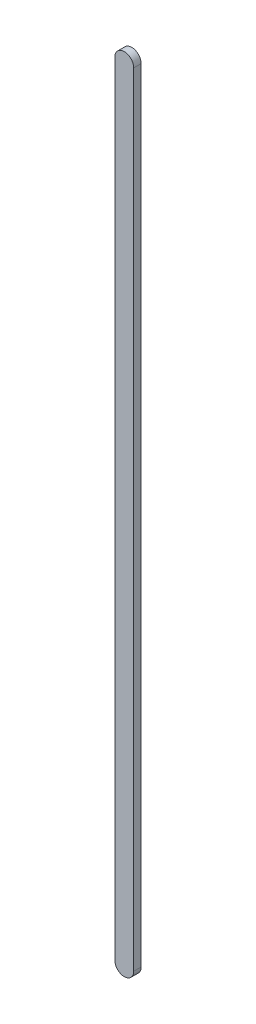
ISO-10303-21;
HEADER;
FILE_DESCRIPTION(('STEP AP214'),'2;1');
FILE_NAME('part.step','',(''),(''),'','','');
FILE_SCHEMA(('AUTOMOTIVE_DESIGN { 1 0 10303 214 1 1 1 1 }'));
ENDSEC;
DATA;
#1=APPLICATION_CONTEXT('core data for automotive mechanical design processes');
#2=APPLICATION_PROTOCOL_DEFINITION('international standard','automotive_design',2000,#1);
#3=PRODUCT_CONTEXT('',#1,'mechanical');
#4=PRODUCT('Part','Part','',(#3));
#5=PRODUCT_RELATED_PRODUCT_CATEGORY('part','',(#4));
#6=PRODUCT_DEFINITION_FORMATION('','',#4);
#7=PRODUCT_DEFINITION_CONTEXT('part definition',#1,'design');
#8=PRODUCT_DEFINITION('design','',#6,#7);
#9=PRODUCT_DEFINITION_SHAPE('','',#8);
#10=(LENGTH_UNIT() NAMED_UNIT(*) SI_UNIT(.MILLI.,.METRE.));
#11=(NAMED_UNIT(*) PLANE_ANGLE_UNIT() SI_UNIT($,.RADIAN.));
#12=(NAMED_UNIT(*) SI_UNIT($,.STERADIAN.) SOLID_ANGLE_UNIT());
#13=UNCERTAINTY_MEASURE_WITH_UNIT(LENGTH_MEASURE(1.E-05),#10,'distance_accuracy_value','');
#14=(GEOMETRIC_REPRESENTATION_CONTEXT(3) GLOBAL_UNCERTAINTY_ASSIGNED_CONTEXT((#13)) GLOBAL_UNIT_ASSIGNED_CONTEXT((#10,
#11,#12)) REPRESENTATION_CONTEXT('',''));
#15=CARTESIAN_POINT('',(0.,0.,0.));
#16=DIRECTION('',(0.,0.,1.));
#17=DIRECTION('',(1.,0.,0.));
#18=AXIS2_PLACEMENT_3D('',#15,#16,#17);
#19=CARTESIAN_POINT('',(111.9632,96.0852028,0.));
#20=DIRECTION('',(-1.,0.,0.));
#21=DIRECTION('',(0.,1.,0.));
#22=AXIS2_PLACEMENT_3D('',#19,#20,#21);
#23=PLANE('',#22);
#24=DIRECTION('',(0.,1.,0.));
#25=VECTOR('',#24,1.);
#26=CARTESIAN_POINT('',(111.9632,96.0852028,0.1999996));
#27=LINE('',#26,#25);
#28=CARTESIAN_POINT('',(111.9632,96.0852028,0.1999996));
#29=VERTEX_POINT('',#28);
#30=CARTESIAN_POINT('',(111.9632,117.1448,0.1999996));
#31=VERTEX_POINT('',#30);
#32=EDGE_CURVE('E11',#29,#31,#27,.T.);
#33=ORIENTED_EDGE('',*,*,#32,.F.);
#34=DIRECTION('',(0.,0.,1.));
#35=VECTOR('',#34,1.);
#36=CARTESIAN_POINT('',(111.9632,96.0852028,0.));
#37=LINE('',#36,#35);
#38=CARTESIAN_POINT('',(111.9632,96.0852028,0.));
#39=VERTEX_POINT('',#38);
#40=EDGE_CURVE('E24',#39,#29,#37,.T.);
#41=ORIENTED_EDGE('',*,*,#40,.F.);
#42=DIRECTION('',(0.,1.,0.));
#43=VECTOR('',#42,1.);
#44=CARTESIAN_POINT('',(111.9632,96.0852028,0.));
#45=LINE('',#44,#43);
#46=CARTESIAN_POINT('',(111.9632,117.1448,0.));
#47=VERTEX_POINT('',#46);
#48=EDGE_CURVE('E75',#39,#47,#45,.T.);
#49=ORIENTED_EDGE('',*,*,#48,.T.);
#50=DIRECTION('',(0.,0.,1.));
#51=VECTOR('',#50,1.);
#52=CARTESIAN_POINT('',(111.9632,117.1448,0.));
#53=LINE('',#52,#51);
#54=EDGE_CURVE('E37',#47,#31,#53,.T.);
#55=ORIENTED_EDGE('',*,*,#54,.T.);
#56=EDGE_LOOP('',(#33,#41,#49,#55));
#57=FACE_BOUND('',#56,.T.);
#58=ADVANCED_FACE('F17',(#57),#23,.F.);
#59=CARTESIAN_POINT('',(111.7092,117.1448,0.));
#60=DIRECTION('',(0.,0.,-1.));
#61=DIRECTION('',(1.,0.,0.));
#62=AXIS2_PLACEMENT_3D('',#59,#60,#61);
#63=CYLINDRICAL_SURFACE('',#62,0.253999999999995);
#64=CARTESIAN_POINT('',(111.7092,117.1448,0.1999996));
#65=DIRECTION('',(0.,0.,1.));
#66=DIRECTION('',(1.,0.,0.));
#67=AXIS2_PLACEMENT_3D('',#64,#65,#66);
#68=CIRCLE('',#67,0.253999999999995);
#69=CARTESIAN_POINT('',(111.4552,117.1448,0.1999996));
#70=VERTEX_POINT('',#69);
#71=EDGE_CURVE('E83',#31,#70,#68,.T.);
#72=ORIENTED_EDGE('',*,*,#71,.F.);
#73=ORIENTED_EDGE('',*,*,#54,.F.);
#74=CARTESIAN_POINT('',(111.7092,117.1448,0.));
#75=DIRECTION('',(0.,0.,1.));
#76=DIRECTION('',(1.,0.,0.));
#77=AXIS2_PLACEMENT_3D('',#74,#75,#76);
#78=CIRCLE('',#77,0.253999999999995);
#79=CARTESIAN_POINT('',(111.4552,117.1448,0.));
#80=VERTEX_POINT('',#79);
#81=EDGE_CURVE('E81',#47,#80,#78,.T.);
#82=ORIENTED_EDGE('',*,*,#81,.T.);
#83=DIRECTION('',(0.,0.,1.));
#84=VECTOR('',#83,1.);
#85=CARTESIAN_POINT('',(111.4552,117.1448,0.));
#86=LINE('',#85,#84);
#87=EDGE_CURVE('E67',#80,#70,#86,.T.);
#88=ORIENTED_EDGE('',*,*,#87,.T.);
#89=EDGE_LOOP('',(#72,#73,#82,#88));
#90=FACE_BOUND('',#89,.T.);
#91=ADVANCED_FACE('F89',(#90),#63,.T.);
#92=CARTESIAN_POINT('',(111.4552,117.1448,0.));
#93=DIRECTION('',(1.,0.,0.));
#94=DIRECTION('',(0.,-1.,0.));
#95=AXIS2_PLACEMENT_3D('',#92,#93,#94);
#96=PLANE('',#95);
#97=DIRECTION('',(0.,-1.,0.));
#98=VECTOR('',#97,1.);
#99=CARTESIAN_POINT('',(111.4552,117.1448,0.1999996));
#100=LINE('',#99,#98);
#101=CARTESIAN_POINT('',(111.4552,96.0852028,0.1999996));
#102=VERTEX_POINT('',#101);
#103=EDGE_CURVE('E71',#70,#102,#100,.T.);
#104=ORIENTED_EDGE('',*,*,#103,.F.);
#105=ORIENTED_EDGE('',*,*,#87,.F.);
#106=DIRECTION('',(0.,-1.,0.));
#107=VECTOR('',#106,1.);
#108=CARTESIAN_POINT('',(111.4552,117.1448,0.));
#109=LINE('',#108,#107);
#110=CARTESIAN_POINT('',(111.4552,96.0852028,0.));
#111=VERTEX_POINT('',#110);
#112=EDGE_CURVE('E63',#80,#111,#109,.T.);
#113=ORIENTED_EDGE('',*,*,#112,.T.);
#114=DIRECTION('',(0.,0.,1.));
#115=VECTOR('',#114,1.);
#116=CARTESIAN_POINT('',(111.4552,96.0852028,0.));
#117=LINE('',#116,#115);
#118=EDGE_CURVE('E53',#111,#102,#117,.T.);
#119=ORIENTED_EDGE('',*,*,#118,.T.);
#120=EDGE_LOOP('',(#104,#105,#113,#119));
#121=FACE_BOUND('',#120,.T.);
#122=ADVANCED_FACE('F66',(#121),#96,.F.);
#123=CARTESIAN_POINT('',(111.7092,96.0852028,0.));
#124=DIRECTION('',(0.,0.,-1.));
#125=DIRECTION('',(-1.,0.,0.));
#126=AXIS2_PLACEMENT_3D('',#123,#124,#125);
#127=CYLINDRICAL_SURFACE('',#126,0.253999999999995);
#128=CARTESIAN_POINT('',(111.7092,96.0852028,0.1999996));
#129=DIRECTION('',(0.,0.,1.));
#130=DIRECTION('',(-1.,0.,0.));
#131=AXIS2_PLACEMENT_3D('',#128,#129,#130);
#132=CIRCLE('',#131,0.253999999999995);
#133=EDGE_CURVE('E59',#102,#29,#132,.T.);
#134=ORIENTED_EDGE('',*,*,#133,.F.);
#135=ORIENTED_EDGE('',*,*,#118,.F.);
#136=CARTESIAN_POINT('',(111.7092,96.0852028,0.));
#137=DIRECTION('',(0.,0.,1.));
#138=DIRECTION('',(-1.,0.,0.));
#139=AXIS2_PLACEMENT_3D('',#136,#137,#138);
#140=CIRCLE('',#139,0.253999999999995);
#141=EDGE_CURVE('E57',#111,#39,#140,.T.);
#142=ORIENTED_EDGE('',*,*,#141,.T.);
#143=ORIENTED_EDGE('',*,*,#40,.T.);
#144=EDGE_LOOP('',(#134,#135,#142,#143));
#145=FACE_BOUND('',#144,.T.);
#146=ADVANCED_FACE('F55',(#145),#127,.T.);
#147=CARTESIAN_POINT('',(111.9632,96.0852028,0.));
#148=DIRECTION('',(0.,0.,-1.));
#149=DIRECTION('',(-1.,0.,0.));
#150=AXIS2_PLACEMENT_3D('',#147,#148,#149);
#151=PLANE('',#150);
#152=ORIENTED_EDGE('',*,*,#141,.F.);
#153=ORIENTED_EDGE('',*,*,#112,.F.);
#154=ORIENTED_EDGE('',*,*,#81,.F.);
#155=ORIENTED_EDGE('',*,*,#48,.F.);
#156=EDGE_LOOP('',(#152,#153,#154,#155));
#157=FACE_BOUND('',#156,.T.);
#158=ADVANCED_FACE('F74',(#157),#151,.T.);
#159=CARTESIAN_POINT('',(111.9632,96.0852028,0.1999996));
#160=DIRECTION('',(0.,0.,-1.));
#161=DIRECTION('',(-1.,0.,0.));
#162=AXIS2_PLACEMENT_3D('',#159,#160,#161);
#163=PLANE('',#162);
#164=ORIENTED_EDGE('',*,*,#32,.T.);
#165=ORIENTED_EDGE('',*,*,#71,.T.);
#166=ORIENTED_EDGE('',*,*,#103,.T.);
#167=ORIENTED_EDGE('',*,*,#133,.T.);
#168=EDGE_LOOP('',(#164,#165,#166,#167));
#169=FACE_BOUND('',#168,.T.);
#170=ADVANCED_FACE('F91',(#169),#163,.F.);
#171=CLOSED_SHELL('',(#58,#91,#122,#146,#158,#170));
#172=MANIFOLD_SOLID_BREP('B1',#171);
#173=ADVANCED_BREP_SHAPE_REPRESENTATION('',(#18,#172),#14);
#174=SHAPE_DEFINITION_REPRESENTATION(#9,#173);
ENDSEC;
END-ISO-10303-21;
